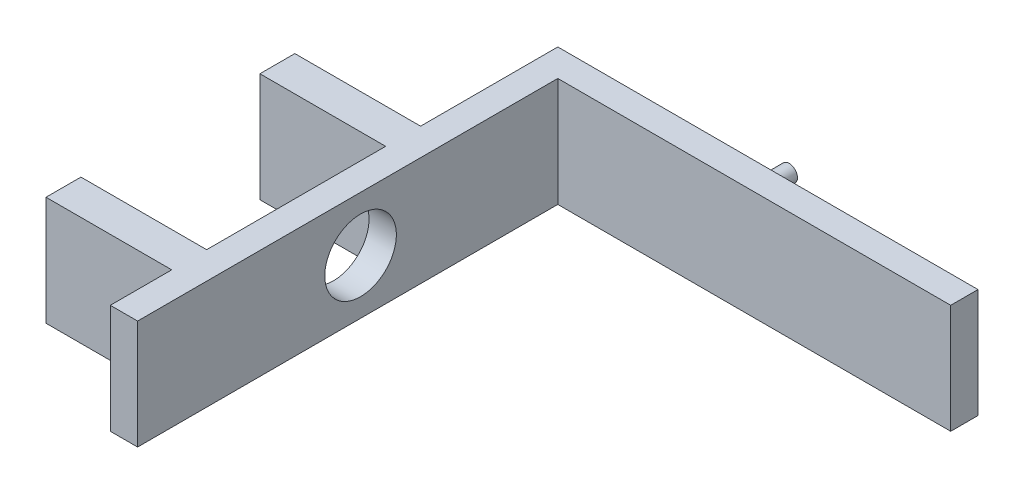
ISO-10303-21;
HEADER;
FILE_DESCRIPTION(('STEP AP214'),'2;1');
FILE_NAME('part.step','',(''),(''),'','','');
FILE_SCHEMA(('AUTOMOTIVE_DESIGN { 1 0 10303 214 1 1 1 1 }'));
ENDSEC;
DATA;
#1=APPLICATION_CONTEXT('core data for automotive mechanical design processes');
#2=APPLICATION_PROTOCOL_DEFINITION('international standard','automotive_design',2000,#1);
#3=PRODUCT_CONTEXT('',#1,'mechanical');
#4=PRODUCT('Part','Part','',(#3));
#5=PRODUCT_RELATED_PRODUCT_CATEGORY('part','',(#4));
#6=PRODUCT_DEFINITION_FORMATION('','',#4);
#7=PRODUCT_DEFINITION_CONTEXT('part definition',#1,'design');
#8=PRODUCT_DEFINITION('design','',#6,#7);
#9=PRODUCT_DEFINITION_SHAPE('','',#8);
#10=(LENGTH_UNIT() NAMED_UNIT(*) SI_UNIT(.MILLI.,.METRE.));
#11=(NAMED_UNIT(*) PLANE_ANGLE_UNIT() SI_UNIT($,.RADIAN.));
#12=(NAMED_UNIT(*) SI_UNIT($,.STERADIAN.) SOLID_ANGLE_UNIT());
#13=UNCERTAINTY_MEASURE_WITH_UNIT(LENGTH_MEASURE(1.E-05),#10,'distance_accuracy_value','');
#14=(GEOMETRIC_REPRESENTATION_CONTEXT(3) GLOBAL_UNCERTAINTY_ASSIGNED_CONTEXT((#13)) GLOBAL_UNIT_ASSIGNED_CONTEXT((#10,
#11,#12)) REPRESENTATION_CONTEXT('',''));
#15=CARTESIAN_POINT('',(0.,0.,0.));
#16=DIRECTION('',(0.,0.,1.));
#17=DIRECTION('',(1.,0.,0.));
#18=AXIS2_PLACEMENT_3D('',#15,#16,#17);
#19=CARTESIAN_POINT('',(-2.75770809575521,7.9375,19.8610872296146));
#20=DIRECTION('',(1.,0.,0.));
#21=DIRECTION('',(0.,0.,-1.));
#22=AXIS2_PLACEMENT_3D('',#19,#20,#21);
#23=PLANE('',#22);
#24=DIRECTION('',(0.,1.,0.));
#25=VECTOR('',#24,1.);
#26=CARTESIAN_POINT('',(-2.75770809575521,7.9375,10.9284401582819));
#27=LINE('',#26,#25);
#28=CARTESIAN_POINT('',(-2.75770809575521,-7.9375,10.9284401582819));
#29=VERTEX_POINT('',#28);
#30=CARTESIAN_POINT('',(-2.75770809575521,7.9375,10.9284401582819));
#31=VERTEX_POINT('',#30);
#32=EDGE_CURVE('E165',#29,#31,#27,.T.);
#33=ORIENTED_EDGE('',*,*,#32,.F.);
#34=DIRECTION('',(0.,0.,1.));
#35=VECTOR('',#34,1.);
#36=CARTESIAN_POINT('',(-2.75770809575521,-7.9375,19.8610872296146));
#37=LINE('',#36,#35);
#38=CARTESIAN_POINT('',(-2.75770809575521,-7.9375,19.8610872296146));
#39=VERTEX_POINT('',#38);
#40=EDGE_CURVE('E247',#29,#39,#37,.T.);
#41=ORIENTED_EDGE('',*,*,#40,.T.);
#42=DIRECTION('',(0.,-1.,0.));
#43=VECTOR('',#42,1.);
#44=CARTESIAN_POINT('',(-2.75770809575521,7.9375,19.8610872296146));
#45=LINE('',#44,#43);
#46=CARTESIAN_POINT('',(-2.75770809575521,7.9375,19.8610872296146));
#47=VERTEX_POINT('',#46);
#48=EDGE_CURVE('E279',#47,#39,#45,.T.);
#49=ORIENTED_EDGE('',*,*,#48,.F.);
#50=DIRECTION('',(0.,0.,1.));
#51=VECTOR('',#50,1.);
#52=CARTESIAN_POINT('',(-2.75770809575521,7.9375,19.8610872296146));
#53=LINE('',#52,#51);
#54=EDGE_CURVE('E55',#31,#47,#53,.T.);
#55=ORIENTED_EDGE('',*,*,#54,.F.);
#56=EDGE_LOOP('',(#33,#41,#49,#55));
#57=FACE_BOUND('',#56,.T.);
#58=ADVANCED_FACE('F39',(#57),#23,.F.);
#59=CARTESIAN_POINT('',(-2.75770809575521,0.,-12.5665598417181));
#60=DIRECTION('',(-1.,0.,0.));
#61=DIRECTION('',(0.,0.,1.));
#62=AXIS2_PLACEMENT_3D('',#59,#60,#61);
#63=CIRCLE('',#62,5.207);
#64=CARTESIAN_POINT('',(-2.75770809575521,0.,-7.35955984171809));
#65=VERTEX_POINT('',#64);
#66=EDGE_CURVE('E214',#65,#65,#63,.T.);
#67=ORIENTED_EDGE('',*,*,#66,.F.);
#68=EDGE_LOOP('',(#67));
#69=FACE_BOUND('',#68,.T.);
#70=DIRECTION('',(0.,-1.,0.));
#71=VECTOR('',#70,1.);
#72=CARTESIAN_POINT('',(-2.75770809575521,7.9375,5.84844015828191));
#73=LINE('',#72,#71);
#74=CARTESIAN_POINT('',(-2.75770809575521,7.9375,5.8484401582819));
#75=VERTEX_POINT('',#74);
#76=CARTESIAN_POINT('',(-2.75770809575521,-7.9375,5.8484401582819));
#77=VERTEX_POINT('',#76);
#78=EDGE_CURVE('E63',#75,#77,#73,.T.);
#79=ORIENTED_EDGE('',*,*,#78,.F.);
#80=CARTESIAN_POINT('',(-2.75770809575521,7.9375,-20.1865598417181));
#81=VERTEX_POINT('',#80);
#82=EDGE_CURVE('E232',#81,#75,#53,.T.);
#83=ORIENTED_EDGE('',*,*,#82,.F.);
#84=DIRECTION('',(0.,1.,0.));
#85=VECTOR('',#84,1.);
#86=CARTESIAN_POINT('',(-2.75770809575521,-7.9375,-20.1865598417181));
#87=LINE('',#86,#85);
#88=CARTESIAN_POINT('',(-2.75770809575521,-7.9375,-20.1865598417181));
#89=VERTEX_POINT('',#88);
#90=EDGE_CURVE('E167',#89,#81,#87,.T.);
#91=ORIENTED_EDGE('',*,*,#90,.F.);
#92=EDGE_CURVE('E252',#89,#77,#37,.T.);
#93=ORIENTED_EDGE('',*,*,#92,.T.);
#94=EDGE_LOOP('',(#79,#83,#91,#93));
#95=FACE_BOUND('',#94,.T.);
#96=ADVANCED_FACE('F347',(#69,#95),#23,.F.);
#97=DIRECTION('',(0.,-1.,0.));
#98=VECTOR('',#97,1.);
#99=CARTESIAN_POINT('',(-2.75770809575521,-7.9375,-25.2665598417181));
#100=LINE('',#99,#98);
#101=CARTESIAN_POINT('',(-2.75770809575521,7.9375,-25.2665598417181));
#102=VERTEX_POINT('',#101);
#103=CARTESIAN_POINT('',(-2.75770809575521,-7.9375,-25.2665598417181));
#104=VERTEX_POINT('',#103);
#105=EDGE_CURVE('E172',#102,#104,#100,.T.);
#106=ORIENTED_EDGE('',*,*,#105,.F.);
#107=CARTESIAN_POINT('',(-2.75770809575521,7.9375,-45.2264127703854));
#108=VERTEX_POINT('',#107);
#109=EDGE_CURVE('E227',#108,#102,#53,.T.);
#110=ORIENTED_EDGE('',*,*,#109,.F.);
#111=DIRECTION('',(0.,-1.,0.));
#112=VECTOR('',#111,1.);
#113=CARTESIAN_POINT('',(-2.75770809575521,7.9375,-45.2264127703854));
#114=LINE('',#113,#112);
#115=CARTESIAN_POINT('',(-2.75770809575521,-7.9375,-45.2264127703854));
#116=VERTEX_POINT('',#115);
#117=EDGE_CURVE('E48',#108,#116,#114,.T.);
#118=ORIENTED_EDGE('',*,*,#117,.T.);
#119=EDGE_CURVE('E248',#116,#104,#37,.T.);
#120=ORIENTED_EDGE('',*,*,#119,.T.);
#121=EDGE_LOOP('',(#106,#110,#118,#120));
#122=FACE_BOUND('',#121,.T.);
#123=ADVANCED_FACE('F288',(#122),#23,.F.);
#124=CARTESIAN_POINT('',(-2.75770809575521,7.9375,-45.2264127703854));
#125=DIRECTION('',(0.,0.,1.));
#126=DIRECTION('',(1.,0.,0.));
#127=AXIS2_PLACEMENT_3D('',#124,#125,#126);
#128=PLANE('',#127);
#129=CARTESIAN_POINT('',(22.0072919042448,0.,-45.2264127703854));
#130=DIRECTION('',(0.,0.,1.));
#131=DIRECTION('',(1.,0.,0.));
#132=AXIS2_PLACEMENT_3D('',#129,#130,#131);
#133=CIRCLE('',#132,1.2065);
#134=CARTESIAN_POINT('',(23.2137919042448,0.,-45.2264127703854));
#135=VERTEX_POINT('',#134);
#136=EDGE_CURVE('E11',#135,#135,#133,.F.);
#137=ORIENTED_EDGE('',*,*,#136,.F.);
#138=EDGE_LOOP('',(#137));
#139=FACE_BOUND('',#138,.T.);
#140=DIRECTION('',(-1.,0.,0.));
#141=VECTOR('',#140,1.);
#142=CARTESIAN_POINT('',(-2.75770809575521,-7.9375,-45.2264127703854));
#143=LINE('',#142,#141);
#144=CARTESIAN_POINT('',(58.3610419042448,-7.9375,-45.2264127703854));
#145=VERTEX_POINT('',#144);
#146=EDGE_CURVE('E222',#145,#116,#143,.T.);
#147=ORIENTED_EDGE('',*,*,#146,.T.);
#148=ORIENTED_EDGE('',*,*,#117,.F.);
#149=DIRECTION('',(-1.,0.,0.));
#150=VECTOR('',#149,1.);
#151=CARTESIAN_POINT('',(6.27967860958227,7.9375,-45.2264127703854));
#152=LINE('',#151,#150);
#153=CARTESIAN_POINT('',(58.3610419042448,7.9375,-45.2264127703854));
#154=VERTEX_POINT('',#153);
#155=EDGE_CURVE('E223',#154,#108,#152,.T.);
#156=ORIENTED_EDGE('',*,*,#155,.F.);
#157=DIRECTION('',(0.,-1.,0.));
#158=VECTOR('',#157,1.);
#159=CARTESIAN_POINT('',(58.3610419042448,7.9375,-45.2264127703854));
#160=LINE('',#159,#158);
#161=EDGE_CURVE('E244',#154,#145,#160,.T.);
#162=ORIENTED_EDGE('',*,*,#161,.T.);
#163=EDGE_LOOP('',(#147,#148,#156,#162));
#164=FACE_BOUND('',#163,.T.);
#165=ADVANCED_FACE('F41',(#139,#164),#128,.F.);
#166=CARTESIAN_POINT('',(-2.75770809575521,7.9375,19.8610872296146));
#167=DIRECTION('',(0.,0.,-1.));
#168=DIRECTION('',(-1.,0.,0.));
#169=AXIS2_PLACEMENT_3D('',#166,#167,#168);
#170=PLANE('',#169);
#171=DIRECTION('',(1.,0.,0.));
#172=VECTOR('',#171,1.);
#173=CARTESIAN_POINT('',(-2.75770809575521,-7.9375,19.8610872296146));
#174=LINE('',#173,#172);
#175=CARTESIAN_POINT('',(1.21104190424479,-7.9375,19.8610872296146));
#176=VERTEX_POINT('',#175);
#177=EDGE_CURVE('E251',#39,#176,#174,.T.);
#178=ORIENTED_EDGE('',*,*,#177,.T.);
#179=DIRECTION('',(0.,-1.,0.));
#180=VECTOR('',#179,1.);
#181=CARTESIAN_POINT('',(1.21104190424479,7.9375,19.8610872296146));
#182=LINE('',#181,#180);
#183=CARTESIAN_POINT('',(1.21104190424479,7.9375,19.8610872296146));
#184=VERTEX_POINT('',#183);
#185=EDGE_CURVE('E275',#184,#176,#182,.T.);
#186=ORIENTED_EDGE('',*,*,#185,.F.);
#187=DIRECTION('',(1.,0.,0.));
#188=VECTOR('',#187,1.);
#189=CARTESIAN_POINT('',(-2.75770809575521,7.9375,19.8610872296146));
#190=LINE('',#189,#188);
#191=EDGE_CURVE('E231',#47,#184,#190,.T.);
#192=ORIENTED_EDGE('',*,*,#191,.F.);
#193=ORIENTED_EDGE('',*,*,#48,.T.);
#194=EDGE_LOOP('',(#178,#186,#192,#193));
#195=FACE_BOUND('',#194,.T.);
#196=ADVANCED_FACE('F319',(#195),#170,.F.);
#197=CARTESIAN_POINT('',(1.21104190424479,7.9375,19.8610872296146));
#198=DIRECTION('',(-1.,0.,0.));
#199=DIRECTION('',(0.,0.,1.));
#200=AXIS2_PLACEMENT_3D('',#197,#198,#199);
#201=PLANE('',#200);
#202=CARTESIAN_POINT('',(1.21104190424479,0.,-12.5665598417181));
#203=DIRECTION('',(-1.,0.,0.));
#204=DIRECTION('',(0.,0.,1.));
#205=AXIS2_PLACEMENT_3D('',#202,#203,#204);
#206=CIRCLE('',#205,5.207);
#207=CARTESIAN_POINT('',(1.21104190424479,0.,-7.35955984171809));
#208=VERTEX_POINT('',#207);
#209=EDGE_CURVE('E218',#208,#208,#206,.F.);
#210=ORIENTED_EDGE('',*,*,#209,.F.);
#211=EDGE_LOOP('',(#210));
#212=FACE_BOUND('',#211,.T.);
#213=DIRECTION('',(0.,0.,-1.));
#214=VECTOR('',#213,1.);
#215=CARTESIAN_POINT('',(1.21104190424479,-7.9375,19.8610872296146));
#216=LINE('',#215,#214);
#217=CARTESIAN_POINT('',(1.21104190424479,-7.9375,-41.2576627703854));
#218=VERTEX_POINT('',#217);
#219=EDGE_CURVE('E255',#176,#218,#216,.T.);
#220=ORIENTED_EDGE('',*,*,#219,.T.);
#221=DIRECTION('',(0.,-1.,0.));
#222=VECTOR('',#221,1.);
#223=CARTESIAN_POINT('',(1.21104190424479,7.9375,-41.2576627703854));
#224=LINE('',#223,#222);
#225=CARTESIAN_POINT('',(1.21104190424479,7.9375,-41.2576627703854));
#226=VERTEX_POINT('',#225);
#227=EDGE_CURVE('E271',#226,#218,#224,.T.);
#228=ORIENTED_EDGE('',*,*,#227,.F.);
#229=DIRECTION('',(0.,0.,-1.));
#230=VECTOR('',#229,1.);
#231=CARTESIAN_POINT('',(1.21104190424479,7.9375,19.8610872296146));
#232=LINE('',#231,#230);
#233=EDGE_CURVE('E235',#184,#226,#232,.T.);
#234=ORIENTED_EDGE('',*,*,#233,.F.);
#235=ORIENTED_EDGE('',*,*,#185,.T.);
#236=EDGE_LOOP('',(#220,#228,#234,#235));
#237=FACE_BOUND('',#236,.T.);
#238=ADVANCED_FACE('F315',(#212,#237),#201,.F.);
#239=CARTESIAN_POINT('',(1.21104190424479,7.9375,-41.2576627703854));
#240=DIRECTION('',(0.,0.,-1.));
#241=DIRECTION('',(-1.,0.,0.));
#242=AXIS2_PLACEMENT_3D('',#239,#240,#241);
#243=PLANE('',#242);
#244=DIRECTION('',(1.,0.,0.));
#245=VECTOR('',#244,1.);
#246=CARTESIAN_POINT('',(1.21104190424479,-7.9375,-41.2576627703854));
#247=LINE('',#246,#245);
#248=CARTESIAN_POINT('',(58.3610419042448,-7.9375,-41.2576627703854));
#249=VERTEX_POINT('',#248);
#250=EDGE_CURVE('E258',#218,#249,#247,.T.);
#251=ORIENTED_EDGE('',*,*,#250,.T.);
#252=DIRECTION('',(0.,-1.,0.));
#253=VECTOR('',#252,1.);
#254=CARTESIAN_POINT('',(58.3610419042448,7.9375,-41.2576627703854));
#255=LINE('',#254,#253);
#256=CARTESIAN_POINT('',(58.3610419042448,7.9375,-41.2576627703854));
#257=VERTEX_POINT('',#256);
#258=EDGE_CURVE('E267',#257,#249,#255,.T.);
#259=ORIENTED_EDGE('',*,*,#258,.F.);
#260=DIRECTION('',(1.,0.,0.));
#261=VECTOR('',#260,1.);
#262=CARTESIAN_POINT('',(1.21104190424479,7.9375,-41.2576627703854));
#263=LINE('',#262,#261);
#264=EDGE_CURVE('E238',#226,#257,#263,.T.);
#265=ORIENTED_EDGE('',*,*,#264,.F.);
#266=ORIENTED_EDGE('',*,*,#227,.T.);
#267=EDGE_LOOP('',(#251,#259,#265,#266));
#268=FACE_BOUND('',#267,.T.);
#269=ADVANCED_FACE('F310',(#268),#243,.F.);
#270=CARTESIAN_POINT('',(58.3610419042448,7.9375,-45.2264127703854));
#271=DIRECTION('',(-1.,0.,0.));
#272=DIRECTION('',(0.,0.,1.));
#273=AXIS2_PLACEMENT_3D('',#270,#271,#272);
#274=PLANE('',#273);
#275=DIRECTION('',(0.,0.,-1.));
#276=VECTOR('',#275,1.);
#277=CARTESIAN_POINT('',(58.3610419042448,-7.9375,-45.2264127703854));
#278=LINE('',#277,#276);
#279=EDGE_CURVE('E226',#249,#145,#278,.T.);
#280=ORIENTED_EDGE('',*,*,#279,.T.);
#281=ORIENTED_EDGE('',*,*,#161,.F.);
#282=DIRECTION('',(0.,0.,-1.));
#283=VECTOR('',#282,1.);
#284=CARTESIAN_POINT('',(58.3610419042448,7.9375,-45.2264127703854));
#285=LINE('',#284,#283);
#286=EDGE_CURVE('E241',#257,#154,#285,.T.);
#287=ORIENTED_EDGE('',*,*,#286,.F.);
#288=ORIENTED_EDGE('',*,*,#258,.T.);
#289=EDGE_LOOP('',(#280,#281,#287,#288));
#290=FACE_BOUND('',#289,.T.);
#291=ADVANCED_FACE('F304',(#290),#274,.F.);
#292=CARTESIAN_POINT('',(0.,7.9375,0.));
#293=DIRECTION('',(0.,-1.,0.));
#294=DIRECTION('',(0.,0.,-1.));
#295=AXIS2_PLACEMENT_3D('',#292,#293,#294);
#296=PLANE('',#295);
#297=ORIENTED_EDGE('',*,*,#155,.T.);
#298=ORIENTED_EDGE('',*,*,#109,.T.);
#299=DIRECTION('',(1.,0.,0.));
#300=VECTOR('',#299,1.);
#301=CARTESIAN_POINT('',(-21.0457080957552,7.9375,-25.2665598417181));
#302=LINE('',#301,#300);
#303=CARTESIAN_POINT('',(-21.0457080957552,7.9375,-25.2665598417181));
#304=VERTEX_POINT('',#303);
#305=EDGE_CURVE('E202',#304,#102,#302,.T.);
#306=ORIENTED_EDGE('',*,*,#305,.F.);
#307=DIRECTION('',(0.,0.,-1.));
#308=VECTOR('',#307,1.);
#309=CARTESIAN_POINT('',(-21.0457080957552,7.9375,-25.2665598417181));
#310=LINE('',#309,#308);
#311=CARTESIAN_POINT('',(-21.0457080957552,7.9375,-20.1865598417181));
#312=VERTEX_POINT('',#311);
#313=EDGE_CURVE('E182',#312,#304,#310,.T.);
#314=ORIENTED_EDGE('',*,*,#313,.F.);
#315=DIRECTION('',(1.,0.,0.));
#316=VECTOR('',#315,1.);
#317=CARTESIAN_POINT('',(-21.0457080957552,7.9375,-20.1865598417181));
#318=LINE('',#317,#316);
#319=EDGE_CURVE('E206',#312,#81,#318,.T.);
#320=ORIENTED_EDGE('',*,*,#319,.T.);
#321=ORIENTED_EDGE('',*,*,#82,.T.);
#322=DIRECTION('',(1.,0.,0.));
#323=VECTOR('',#322,1.);
#324=CARTESIAN_POINT('',(-21.0457080957552,7.9375,5.84844015828191));
#325=LINE('',#324,#323);
#326=CARTESIAN_POINT('',(-21.0457080957552,7.9375,5.84844015828191));
#327=VERTEX_POINT('',#326);
#328=EDGE_CURVE('E148',#327,#75,#325,.T.);
#329=ORIENTED_EDGE('',*,*,#328,.F.);
#330=DIRECTION('',(0.,0.,-1.));
#331=VECTOR('',#330,1.);
#332=CARTESIAN_POINT('',(-21.0457080957552,7.9375,10.9284401582819));
#333=LINE('',#332,#331);
#334=CARTESIAN_POINT('',(-21.0457080957552,7.9375,10.9284401582819));
#335=VERTEX_POINT('',#334);
#336=EDGE_CURVE('E141',#335,#327,#333,.T.);
#337=ORIENTED_EDGE('',*,*,#336,.F.);
#338=DIRECTION('',(1.,0.,0.));
#339=VECTOR('',#338,1.);
#340=CARTESIAN_POINT('',(-21.0457080957552,7.9375,10.9284401582819));
#341=LINE('',#340,#339);
#342=EDGE_CURVE('E145',#335,#31,#341,.T.);
#343=ORIENTED_EDGE('',*,*,#342,.T.);
#344=ORIENTED_EDGE('',*,*,#54,.T.);
#345=ORIENTED_EDGE('',*,*,#191,.T.);
#346=ORIENTED_EDGE('',*,*,#233,.T.);
#347=ORIENTED_EDGE('',*,*,#264,.T.);
#348=ORIENTED_EDGE('',*,*,#286,.T.);
#349=EDGE_LOOP('',(#297,#298,#306,#314,#320,#321,#329,#337,#343,#344,#345,#346,#347,#348));
#350=FACE_BOUND('',#349,.T.);
#351=ADVANCED_FACE('F143',(#350),#296,.F.);
#352=CARTESIAN_POINT('',(0.,-7.9375,0.));
#353=DIRECTION('',(0.,-1.,0.));
#354=DIRECTION('',(0.,0.,-1.));
#355=AXIS2_PLACEMENT_3D('',#352,#353,#354);
#356=PLANE('',#355);
#357=ORIENTED_EDGE('',*,*,#146,.F.);
#358=ORIENTED_EDGE('',*,*,#279,.F.);
#359=ORIENTED_EDGE('',*,*,#250,.F.);
#360=ORIENTED_EDGE('',*,*,#219,.F.);
#361=ORIENTED_EDGE('',*,*,#177,.F.);
#362=ORIENTED_EDGE('',*,*,#40,.F.);
#363=DIRECTION('',(1.,0.,0.));
#364=VECTOR('',#363,1.);
#365=CARTESIAN_POINT('',(-21.0457080957552,-7.9375,10.9284401582819));
#366=LINE('',#365,#364);
#367=CARTESIAN_POINT('',(-21.0457080957552,-7.9375,10.9284401582819));
#368=VERTEX_POINT('',#367);
#369=EDGE_CURVE('E320',#368,#29,#366,.T.);
#370=ORIENTED_EDGE('',*,*,#369,.F.);
#371=DIRECTION('',(0.,0.,1.));
#372=VECTOR('',#371,1.);
#373=CARTESIAN_POINT('',(-21.0457080957552,-7.9375,10.9284401582819));
#374=LINE('',#373,#372);
#375=CARTESIAN_POINT('',(-21.0457080957552,-7.9375,5.8484401582819));
#376=VERTEX_POINT('',#375);
#377=EDGE_CURVE('E158',#376,#368,#374,.T.);
#378=ORIENTED_EDGE('',*,*,#377,.F.);
#379=DIRECTION('',(1.,0.,0.));
#380=VECTOR('',#379,1.);
#381=CARTESIAN_POINT('',(-21.0457080957552,-7.9375,5.8484401582819));
#382=LINE('',#381,#380);
#383=EDGE_CURVE('E174',#376,#77,#382,.T.);
#384=ORIENTED_EDGE('',*,*,#383,.T.);
#385=ORIENTED_EDGE('',*,*,#92,.F.);
#386=DIRECTION('',(1.,0.,0.));
#387=VECTOR('',#386,1.);
#388=CARTESIAN_POINT('',(-21.0457080957552,-7.9375,-20.1865598417181));
#389=LINE('',#388,#387);
#390=CARTESIAN_POINT('',(-21.0457080957552,-7.9375,-20.1865598417181));
#391=VERTEX_POINT('',#390);
#392=EDGE_CURVE('E190',#391,#89,#389,.T.);
#393=ORIENTED_EDGE('',*,*,#392,.F.);
#394=DIRECTION('',(0.,0.,1.));
#395=VECTOR('',#394,1.);
#396=CARTESIAN_POINT('',(-21.0457080957552,-7.9375,-25.2665598417181));
#397=LINE('',#396,#395);
#398=CARTESIAN_POINT('',(-21.0457080957552,-7.9375,-25.2665598417181));
#399=VERTEX_POINT('',#398);
#400=EDGE_CURVE('E188',#399,#391,#397,.T.);
#401=ORIENTED_EDGE('',*,*,#400,.F.);
#402=DIRECTION('',(1.,0.,0.));
#403=VECTOR('',#402,1.);
#404=CARTESIAN_POINT('',(-21.0457080957552,-7.9375,-25.2665598417181));
#405=LINE('',#404,#403);
#406=EDGE_CURVE('E198',#399,#104,#405,.T.);
#407=ORIENTED_EDGE('',*,*,#406,.T.);
#408=ORIENTED_EDGE('',*,*,#119,.F.);
#409=EDGE_LOOP('',(#357,#358,#359,#360,#361,#362,#370,#378,#384,#385,#393,#401,#407,#408));
#410=FACE_BOUND('',#409,.T.);
#411=ADVANCED_FACE('F292',(#410),#356,.T.);
#412=CARTESIAN_POINT('',(15.9386619427982,0.,-12.5665598417181));
#413=DIRECTION('',(-1.,0.,0.));
#414=DIRECTION('',(0.,0.,1.));
#415=AXIS2_PLACEMENT_3D('',#412,#413,#414);
#416=CYLINDRICAL_SURFACE('',#415,5.207);
#417=ORIENTED_EDGE('',*,*,#209,.T.);
#418=EDGE_LOOP('',(#417));
#419=FACE_BOUND('',#418,.T.);
#420=ORIENTED_EDGE('',*,*,#66,.T.);
#421=EDGE_LOOP('',(#420));
#422=FACE_BOUND('',#421,.T.);
#423=ADVANCED_FACE('F367',(#419,#422),#416,.F.);
#424=CARTESIAN_POINT('',(22.0072919042448,0.,-54.1164127703854));
#425=DIRECTION('',(0.,0.,1.));
#426=DIRECTION('',(1.,0.,0.));
#427=AXIS2_PLACEMENT_3D('',#424,#425,#426);
#428=CYLINDRICAL_SURFACE('',#427,1.2065);
#429=CARTESIAN_POINT('',(22.0072919042448,0.,-54.1164127703854));
#430=DIRECTION('',(0.,0.,-1.));
#431=DIRECTION('',(-1.,0.,0.));
#432=AXIS2_PLACEMENT_3D('',#429,#430,#431);
#433=CIRCLE('',#432,1.2065);
#434=CARTESIAN_POINT('',(20.8007919042448,0.,-54.1164127703854));
#435=VERTEX_POINT('',#434);
#436=EDGE_CURVE('E210',#435,#435,#433,.T.);
#437=ORIENTED_EDGE('',*,*,#436,.F.);
#438=EDGE_LOOP('',(#437));
#439=FACE_BOUND('',#438,.T.);
#440=ORIENTED_EDGE('',*,*,#136,.T.);
#441=EDGE_LOOP('',(#440));
#442=FACE_BOUND('',#441,.T.);
#443=ADVANCED_FACE('F372',(#439,#442),#428,.T.);
#444=CARTESIAN_POINT('',(22.0072919042448,0.,-54.1164127703854));
#445=DIRECTION('',(0.,0.,-1.));
#446=DIRECTION('',(-1.,0.,0.));
#447=AXIS2_PLACEMENT_3D('',#444,#445,#446);
#448=PLANE('',#447);
#449=ORIENTED_EDGE('',*,*,#436,.T.);
#450=EDGE_LOOP('',(#449));
#451=FACE_BOUND('',#450,.T.);
#452=ADVANCED_FACE('F376',(#451),#448,.T.);
#453=CARTESIAN_POINT('',(-21.0457080957552,-7.9375,-20.1865598417181));
#454=DIRECTION('',(0.,0.,-1.));
#455=DIRECTION('',(-1.,0.,0.));
#456=AXIS2_PLACEMENT_3D('',#453,#454,#455);
#457=PLANE('',#456);
#458=ORIENTED_EDGE('',*,*,#90,.T.);
#459=ORIENTED_EDGE('',*,*,#319,.F.);
#460=DIRECTION('',(0.,1.,0.));
#461=VECTOR('',#460,1.);
#462=CARTESIAN_POINT('',(-21.0457080957552,-7.9375,-20.1865598417181));
#463=LINE('',#462,#461);
#464=EDGE_CURVE('E178',#391,#312,#463,.T.);
#465=ORIENTED_EDGE('',*,*,#464,.F.);
#466=ORIENTED_EDGE('',*,*,#392,.T.);
#467=EDGE_LOOP('',(#458,#459,#465,#466));
#468=FACE_BOUND('',#467,.T.);
#469=ADVANCED_FACE('F341',(#468),#457,.F.);
#470=CARTESIAN_POINT('',(-21.0457080957552,-7.9375,-25.2665598417181));
#471=DIRECTION('',(0.,0.,1.));
#472=DIRECTION('',(1.,0.,0.));
#473=AXIS2_PLACEMENT_3D('',#470,#471,#472);
#474=PLANE('',#473);
#475=ORIENTED_EDGE('',*,*,#105,.T.);
#476=ORIENTED_EDGE('',*,*,#406,.F.);
#477=DIRECTION('',(0.,-1.,0.));
#478=VECTOR('',#477,1.);
#479=CARTESIAN_POINT('',(-21.0457080957552,-7.9375,-25.2665598417181));
#480=LINE('',#479,#478);
#481=EDGE_CURVE('E185',#304,#399,#480,.T.);
#482=ORIENTED_EDGE('',*,*,#481,.F.);
#483=ORIENTED_EDGE('',*,*,#305,.T.);
#484=EDGE_LOOP('',(#475,#476,#482,#483));
#485=FACE_BOUND('',#484,.T.);
#486=ADVANCED_FACE('F299',(#485),#474,.F.);
#487=CARTESIAN_POINT('',(-21.0457080957552,0.,0.));
#488=DIRECTION('',(1.,0.,0.));
#489=DIRECTION('',(0.,0.,-1.));
#490=AXIS2_PLACEMENT_3D('',#487,#488,#489);
#491=PLANE('',#490);
#492=ORIENTED_EDGE('',*,*,#464,.T.);
#493=ORIENTED_EDGE('',*,*,#313,.T.);
#494=ORIENTED_EDGE('',*,*,#481,.T.);
#495=ORIENTED_EDGE('',*,*,#400,.T.);
#496=EDGE_LOOP('',(#492,#493,#494,#495));
#497=FACE_BOUND('',#496,.T.);
#498=ADVANCED_FACE('F344',(#497),#491,.F.);
#499=CARTESIAN_POINT('',(-21.0457080957552,7.9375,10.9284401582819));
#500=DIRECTION('',(0.,0.,-1.));
#501=DIRECTION('',(0.,1.,0.));
#502=AXIS2_PLACEMENT_3D('',#499,#500,#501);
#503=PLANE('',#502);
#504=ORIENTED_EDGE('',*,*,#32,.T.);
#505=ORIENTED_EDGE('',*,*,#342,.F.);
#506=DIRECTION('',(0.,1.,0.));
#507=VECTOR('',#506,1.);
#508=CARTESIAN_POINT('',(-21.0457080957552,7.9375,10.9284401582819));
#509=LINE('',#508,#507);
#510=EDGE_CURVE('E153',#368,#335,#509,.T.);
#511=ORIENTED_EDGE('',*,*,#510,.F.);
#512=ORIENTED_EDGE('',*,*,#369,.T.);
#513=EDGE_LOOP('',(#504,#505,#511,#512));
#514=FACE_BOUND('',#513,.T.);
#515=ADVANCED_FACE('F164',(#514),#503,.F.);
#516=CARTESIAN_POINT('',(-21.0457080957552,7.9375,5.84844015828191));
#517=DIRECTION('',(0.,0.,1.));
#518=DIRECTION('',(0.,-1.,0.));
#519=AXIS2_PLACEMENT_3D('',#516,#517,#518);
#520=PLANE('',#519);
#521=ORIENTED_EDGE('',*,*,#78,.T.);
#522=ORIENTED_EDGE('',*,*,#383,.F.);
#523=DIRECTION('',(0.,-1.,0.));
#524=VECTOR('',#523,1.);
#525=CARTESIAN_POINT('',(-21.0457080957552,7.9375,5.84844015828191));
#526=LINE('',#525,#524);
#527=EDGE_CURVE('E152',#327,#376,#526,.T.);
#528=ORIENTED_EDGE('',*,*,#527,.F.);
#529=ORIENTED_EDGE('',*,*,#328,.T.);
#530=EDGE_LOOP('',(#521,#522,#528,#529));
#531=FACE_BOUND('',#530,.T.);
#532=ADVANCED_FACE('F336',(#531),#520,.F.);
#533=CARTESIAN_POINT('',(-21.0457080957552,0.,0.));
#534=DIRECTION('',(1.,0.,0.));
#535=DIRECTION('',(0.,0.,-1.));
#536=AXIS2_PLACEMENT_3D('',#533,#534,#535);
#537=PLANE('',#536);
#538=ORIENTED_EDGE('',*,*,#510,.T.);
#539=ORIENTED_EDGE('',*,*,#336,.T.);
#540=ORIENTED_EDGE('',*,*,#527,.T.);
#541=ORIENTED_EDGE('',*,*,#377,.T.);
#542=EDGE_LOOP('',(#538,#539,#540,#541));
#543=FACE_BOUND('',#542,.T.);
#544=ADVANCED_FACE('F156',(#543),#537,.F.);
#545=CLOSED_SHELL('',(#58,#96,#123,#165,#196,#238,#269,#291,#351,#411,#423,#443,#452,#469,#486,
#498,#515,#532,#544));
#546=MANIFOLD_SOLID_BREP('B2',#545);
#547=ADVANCED_BREP_SHAPE_REPRESENTATION('',(#18,#546),#14);
#548=SHAPE_DEFINITION_REPRESENTATION(#9,#547);
ENDSEC;
END-ISO-10303-21;
